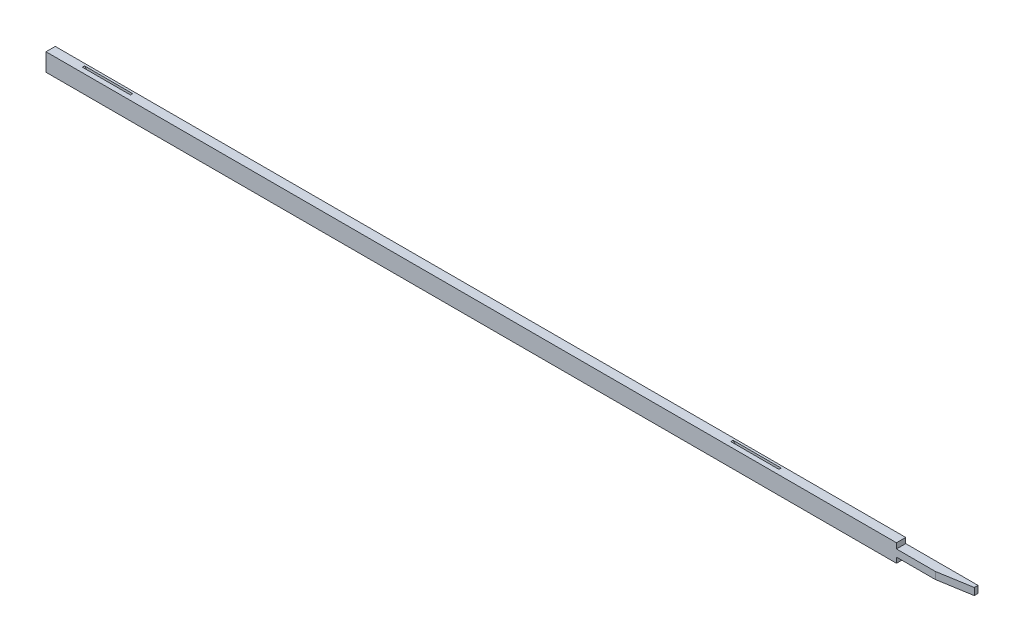
ISO-10303-21;
HEADER;
FILE_DESCRIPTION(('STEP AP214'),'2;1');
FILE_NAME('part.step','',(''),(''),'','','');
FILE_SCHEMA(('AUTOMOTIVE_DESIGN { 1 0 10303 214 1 1 1 1 }'));
ENDSEC;
DATA;
#1=APPLICATION_CONTEXT('core data for automotive mechanical design processes');
#2=APPLICATION_PROTOCOL_DEFINITION('international standard','automotive_design',2000,#1);
#3=PRODUCT_CONTEXT('',#1,'mechanical');
#4=PRODUCT('Part','Part','',(#3));
#5=PRODUCT_RELATED_PRODUCT_CATEGORY('part','',(#4));
#6=PRODUCT_DEFINITION_FORMATION('','',#4);
#7=PRODUCT_DEFINITION_CONTEXT('part definition',#1,'design');
#8=PRODUCT_DEFINITION('design','',#6,#7);
#9=PRODUCT_DEFINITION_SHAPE('','',#8);
#10=(LENGTH_UNIT() NAMED_UNIT(*) SI_UNIT(.MILLI.,.METRE.));
#11=(NAMED_UNIT(*) PLANE_ANGLE_UNIT() SI_UNIT($,.RADIAN.));
#12=(NAMED_UNIT(*) SI_UNIT($,.STERADIAN.) SOLID_ANGLE_UNIT());
#13=UNCERTAINTY_MEASURE_WITH_UNIT(LENGTH_MEASURE(1.E-05),#10,'distance_accuracy_value','');
#14=(GEOMETRIC_REPRESENTATION_CONTEXT(3) GLOBAL_UNCERTAINTY_ASSIGNED_CONTEXT((#13)) GLOBAL_UNIT_ASSIGNED_CONTEXT((#10,
#11,#12)) REPRESENTATION_CONTEXT('',''));
#15=CARTESIAN_POINT('',(0.,0.,0.));
#16=DIRECTION('',(0.,0.,1.));
#17=DIRECTION('',(1.,0.,0.));
#18=AXIS2_PLACEMENT_3D('',#15,#16,#17);
#19=CARTESIAN_POINT('',(92.5000000000003,16.5000000000001,6.));
#20=DIRECTION('',(0.,0.,-1.));
#21=DIRECTION('',(-1.,0.,0.));
#22=AXIS2_PLACEMENT_3D('',#19,#20,#21);
#23=PLANE('',#22);
#24=DIRECTION('',(1.,0.,0.));
#25=VECTOR('',#24,1.);
#26=CARTESIAN_POINT('',(92.5000000000003,24.0000000000001,6.));
#27=LINE('',#26,#25);
#28=CARTESIAN_POINT('',(85.0000000000002,24.0000000000001,6.));
#29=VERTEX_POINT('',#28);
#30=CARTESIAN_POINT('',(215.000000000001,24.0000000000001,6.00000000000004));
#31=VERTEX_POINT('',#30);
#32=EDGE_CURVE('E11',#29,#31,#27,.T.);
#33=ORIENTED_EDGE('',*,*,#32,.F.);
#34=DIRECTION('',(0.707106781186549,-0.707106781186546,0.));
#35=VECTOR('',#34,1.);
#36=CARTESIAN_POINT('',(92.5000000000003,16.5000000000001,6.));
#37=LINE('',#36,#35);
#38=CARTESIAN_POINT('',(92.5000000000003,16.5000000000001,6.));
#39=VERTEX_POINT('',#38);
#40=EDGE_CURVE('E370',#39,#29,#37,.F.);
#41=ORIENTED_EDGE('',*,*,#40,.F.);
#42=DIRECTION('',(1.,0.,0.));
#43=VECTOR('',#42,1.);
#44=CARTESIAN_POINT('',(92.5000000000003,16.5000000000001,6.));
#45=LINE('',#44,#43);
#46=CARTESIAN_POINT('',(207.5,16.5000000000001,6.00000000000004));
#47=VERTEX_POINT('',#46);
#48=EDGE_CURVE('E355',#39,#47,#45,.T.);
#49=ORIENTED_EDGE('',*,*,#48,.T.);
#50=DIRECTION('',(-0.707106781186549,-0.707106781186546,0.));
#51=VECTOR('',#50,1.);
#52=CARTESIAN_POINT('',(150.,-41.,6.00000000000002));
#53=LINE('',#52,#51);
#54=EDGE_CURVE('E42',#47,#31,#53,.F.);
#55=ORIENTED_EDGE('',*,*,#54,.T.);
#56=EDGE_LOOP('',(#33,#41,#49,#55));
#57=FACE_BOUND('',#56,.T.);
#58=ADVANCED_FACE('F35',(#57),#23,.F.);
#59=CARTESIAN_POINT('',(207.5,16.5000000000001,6.00000000000004));
#60=DIRECTION('',(-0.707106781186546,0.707106781186549,0.));
#61=DIRECTION('',(0.707106781186549,0.707106781186546,0.));
#62=AXIS2_PLACEMENT_3D('',#59,#60,#61);
#63=PLANE('',#62);
#64=DIRECTION('',(0.,0.,-1.));
#65=VECTOR('',#64,1.);
#66=CARTESIAN_POINT('',(215.000000000001,24.0000000000001,6.00000000000031));
#67=LINE('',#66,#65);
#68=CARTESIAN_POINT('',(215.,24.0000000000001,12.));
#69=VERTEX_POINT('',#68);
#70=EDGE_CURVE('E57',#31,#69,#67,.F.);
#71=ORIENTED_EDGE('',*,*,#70,.F.);
#72=ORIENTED_EDGE('',*,*,#54,.F.);
#73=DIRECTION('',(0.,0.,1.));
#74=VECTOR('',#73,1.);
#75=CARTESIAN_POINT('',(207.5,16.5000000000001,6.00000000000004));
#76=LINE('',#75,#74);
#77=CARTESIAN_POINT('',(207.5,16.5000000000001,12.));
#78=VERTEX_POINT('',#77);
#79=EDGE_CURVE('E352',#47,#78,#76,.T.);
#80=ORIENTED_EDGE('',*,*,#79,.T.);
#81=DIRECTION('',(-0.707106781186549,-0.707106781186546,0.));
#82=VECTOR('',#81,1.);
#83=CARTESIAN_POINT('',(207.5,16.5000000000002,12.));
#84=LINE('',#83,#82);
#85=EDGE_CURVE('E363',#78,#69,#84,.F.);
#86=ORIENTED_EDGE('',*,*,#85,.T.);
#87=EDGE_LOOP('',(#71,#72,#80,#86));
#88=FACE_BOUND('',#87,.T.);
#89=ADVANCED_FACE('F387',(#88),#63,.T.);
#90=CARTESIAN_POINT('',(92.5000000000003,16.5000000000001,12.));
#91=DIRECTION('',(0.707106781186546,0.707106781186549,0.));
#92=DIRECTION('',(0.707106781186549,-0.707106781186546,0.));
#93=AXIS2_PLACEMENT_3D('',#90,#91,#92);
#94=PLANE('',#93);
#95=DIRECTION('',(0.,0.,1.));
#96=VECTOR('',#95,1.);
#97=CARTESIAN_POINT('',(85.0000000000002,24.0000000000001,12.));
#98=LINE('',#97,#96);
#99=CARTESIAN_POINT('',(85.0000000000002,24.0000000000001,12.));
#100=VERTEX_POINT('',#99);
#101=EDGE_CURVE('E368',#100,#29,#98,.F.);
#102=ORIENTED_EDGE('',*,*,#101,.F.);
#103=DIRECTION('',(0.707106781186549,-0.707106781186546,0.));
#104=VECTOR('',#103,1.);
#105=CARTESIAN_POINT('',(150.,-40.9999999999999,12.));
#106=LINE('',#105,#104);
#107=CARTESIAN_POINT('',(92.5000000000003,16.5000000000001,12.));
#108=VERTEX_POINT('',#107);
#109=EDGE_CURVE('E365',#108,#100,#106,.F.);
#110=ORIENTED_EDGE('',*,*,#109,.F.);
#111=DIRECTION('',(0.,0.,-1.));
#112=VECTOR('',#111,1.);
#113=CARTESIAN_POINT('',(92.5000000000003,16.5000000000001,12.));
#114=LINE('',#113,#112);
#115=EDGE_CURVE('E358',#108,#39,#114,.T.);
#116=ORIENTED_EDGE('',*,*,#115,.T.);
#117=ORIENTED_EDGE('',*,*,#40,.T.);
#118=EDGE_LOOP('',(#102,#110,#116,#117));
#119=FACE_BOUND('',#118,.T.);
#120=ADVANCED_FACE('F382',(#119),#94,.T.);
#121=CARTESIAN_POINT('',(207.5,16.5000000000001,12.));
#122=DIRECTION('',(0.,0.,1.));
#123=DIRECTION('',(1.,0.,0.));
#124=AXIS2_PLACEMENT_3D('',#121,#122,#123);
#125=PLANE('',#124);
#126=DIRECTION('',(-1.,0.,0.));
#127=VECTOR('',#126,1.);
#128=CARTESIAN_POINT('',(207.5,24.0000000000001,12.));
#129=LINE('',#128,#127);
#130=EDGE_CURVE('E361',#69,#100,#129,.T.);
#131=ORIENTED_EDGE('',*,*,#130,.F.);
#132=ORIENTED_EDGE('',*,*,#85,.F.);
#133=DIRECTION('',(-1.,0.,0.));
#134=VECTOR('',#133,1.);
#135=CARTESIAN_POINT('',(207.5,16.5000000000001,12.));
#136=LINE('',#135,#134);
#137=EDGE_CURVE('E350',#78,#108,#136,.T.);
#138=ORIENTED_EDGE('',*,*,#137,.T.);
#139=ORIENTED_EDGE('',*,*,#109,.T.);
#140=EDGE_LOOP('',(#131,#132,#138,#139));
#141=FACE_BOUND('',#140,.T.);
#142=ADVANCED_FACE('F389',(#141),#125,.F.);
#143=CARTESIAN_POINT('',(-1750.,16.5,0.));
#144=DIRECTION('',(0.,1.,0.));
#145=DIRECTION('',(1.,0.,0.));
#146=AXIS2_PLACEMENT_3D('',#143,#144,#145);
#147=PLANE('',#146);
#148=ORIENTED_EDGE('',*,*,#137,.F.);
#149=ORIENTED_EDGE('',*,*,#79,.F.);
#150=ORIENTED_EDGE('',*,*,#48,.F.);
#151=ORIENTED_EDGE('',*,*,#115,.F.);
#152=EDGE_LOOP('',(#148,#149,#150,#151));
#153=FACE_BOUND('',#152,.T.);
#154=ADVANCED_FACE('F385',(#153),#147,.T.);
#155=CARTESIAN_POINT('',(207.5,-16.4999999999999,12.));
#156=DIRECTION('',(0.,0.,1.));
#157=DIRECTION('',(1.,0.,0.));
#158=AXIS2_PLACEMENT_3D('',#155,#156,#157);
#159=PLANE('',#158);
#160=DIRECTION('',(-1.,0.,0.));
#161=VECTOR('',#160,1.);
#162=CARTESIAN_POINT('',(207.5,-23.9999999999999,12.));
#163=LINE('',#162,#161);
#164=CARTESIAN_POINT('',(215.,-23.9999999999999,12.));
#165=VERTEX_POINT('',#164);
#166=CARTESIAN_POINT('',(85.0000000000002,-23.9999999999999,12.));
#167=VERTEX_POINT('',#166);
#168=EDGE_CURVE('E347',#165,#167,#163,.T.);
#169=ORIENTED_EDGE('',*,*,#168,.T.);
#170=DIRECTION('',(0.707106781186549,0.707106781186546,0.));
#171=VECTOR('',#170,1.);
#172=CARTESIAN_POINT('',(150.,41.0000000000001,12.));
#173=LINE('',#172,#171);
#174=CARTESIAN_POINT('',(92.5000000000003,-16.4999999999999,12.));
#175=VERTEX_POINT('',#174);
#176=EDGE_CURVE('E334',#175,#167,#173,.F.);
#177=ORIENTED_EDGE('',*,*,#176,.F.);
#178=DIRECTION('',(-1.,0.,0.));
#179=VECTOR('',#178,1.);
#180=CARTESIAN_POINT('',(207.5,-16.4999999999999,12.));
#181=LINE('',#180,#179);
#182=CARTESIAN_POINT('',(207.5,-16.4999999999999,12.));
#183=VERTEX_POINT('',#182);
#184=EDGE_CURVE('E320',#183,#175,#181,.T.);
#185=ORIENTED_EDGE('',*,*,#184,.F.);
#186=DIRECTION('',(-0.707106781186549,0.707106781186546,0.));
#187=VECTOR('',#186,1.);
#188=CARTESIAN_POINT('',(207.5,-16.5,12.));
#189=LINE('',#188,#187);
#190=EDGE_CURVE('E344',#183,#165,#189,.F.);
#191=ORIENTED_EDGE('',*,*,#190,.T.);
#192=EDGE_LOOP('',(#169,#177,#185,#191));
#193=FACE_BOUND('',#192,.T.);
#194=ADVANCED_FACE('F396',(#193),#159,.F.);
#195=CARTESIAN_POINT('',(207.5,-16.4999999999999,6.00000000000004));
#196=DIRECTION('',(-0.707106781186546,-0.707106781186549,0.));
#197=DIRECTION('',(0.707106781186549,-0.707106781186546,0.));
#198=AXIS2_PLACEMENT_3D('',#195,#196,#197);
#199=PLANE('',#198);
#200=DIRECTION('',(0.,0.,-1.));
#201=VECTOR('',#200,1.);
#202=CARTESIAN_POINT('',(215.000000000001,-23.9999999999999,6.00000000000031));
#203=LINE('',#202,#201);
#204=CARTESIAN_POINT('',(215.000000000001,-23.9999999999999,6.00000000000004));
#205=VERTEX_POINT('',#204);
#206=EDGE_CURVE('E342',#205,#165,#203,.F.);
#207=ORIENTED_EDGE('',*,*,#206,.T.);
#208=ORIENTED_EDGE('',*,*,#190,.F.);
#209=DIRECTION('',(0.,0.,1.));
#210=VECTOR('',#209,1.);
#211=CARTESIAN_POINT('',(207.5,-16.4999999999999,6.00000000000004));
#212=LINE('',#211,#210);
#213=CARTESIAN_POINT('',(207.5,-16.4999999999999,6.00000000000004));
#214=VERTEX_POINT('',#213);
#215=EDGE_CURVE('E326',#214,#183,#212,.T.);
#216=ORIENTED_EDGE('',*,*,#215,.F.);
#217=DIRECTION('',(-0.707106781186549,0.707106781186546,0.));
#218=VECTOR('',#217,1.);
#219=CARTESIAN_POINT('',(150.,41.0000000000002,6.00000000000002));
#220=LINE('',#219,#218);
#221=EDGE_CURVE('E339',#214,#205,#220,.F.);
#222=ORIENTED_EDGE('',*,*,#221,.T.);
#223=EDGE_LOOP('',(#207,#208,#216,#222));
#224=FACE_BOUND('',#223,.T.);
#225=ADVANCED_FACE('F428',(#224),#199,.T.);
#226=CARTESIAN_POINT('',(92.5000000000003,-16.4999999999999,6.));
#227=DIRECTION('',(0.,0.,-1.));
#228=DIRECTION('',(-1.,0.,0.));
#229=AXIS2_PLACEMENT_3D('',#226,#227,#228);
#230=PLANE('',#229);
#231=DIRECTION('',(1.,0.,0.));
#232=VECTOR('',#231,1.);
#233=CARTESIAN_POINT('',(92.5000000000003,-23.9999999999999,6.));
#234=LINE('',#233,#232);
#235=CARTESIAN_POINT('',(85.0000000000002,-23.9999999999999,6.));
#236=VERTEX_POINT('',#235);
#237=EDGE_CURVE('E337',#236,#205,#234,.T.);
#238=ORIENTED_EDGE('',*,*,#237,.T.);
#239=ORIENTED_EDGE('',*,*,#221,.F.);
#240=DIRECTION('',(1.,0.,0.));
#241=VECTOR('',#240,1.);
#242=CARTESIAN_POINT('',(92.5000000000003,-16.4999999999999,6.));
#243=LINE('',#242,#241);
#244=CARTESIAN_POINT('',(92.5000000000003,-16.4999999999999,6.));
#245=VERTEX_POINT('',#244);
#246=EDGE_CURVE('E324',#245,#214,#243,.T.);
#247=ORIENTED_EDGE('',*,*,#246,.F.);
#248=DIRECTION('',(0.707106781186549,0.707106781186546,0.));
#249=VECTOR('',#248,1.);
#250=CARTESIAN_POINT('',(92.5000000000003,-16.4999999999999,6.));
#251=LINE('',#250,#249);
#252=EDGE_CURVE('E331',#245,#236,#251,.F.);
#253=ORIENTED_EDGE('',*,*,#252,.T.);
#254=EDGE_LOOP('',(#238,#239,#247,#253));
#255=FACE_BOUND('',#254,.T.);
#256=ADVANCED_FACE('F438',(#255),#230,.F.);
#257=CARTESIAN_POINT('',(92.5000000000003,-16.4999999999999,12.));
#258=DIRECTION('',(0.707106781186546,-0.707106781186549,0.));
#259=DIRECTION('',(0.707106781186549,0.707106781186546,0.));
#260=AXIS2_PLACEMENT_3D('',#257,#258,#259);
#261=PLANE('',#260);
#262=DIRECTION('',(0.,0.,1.));
#263=VECTOR('',#262,1.);
#264=CARTESIAN_POINT('',(85.0000000000002,-23.9999999999999,12.));
#265=LINE('',#264,#263);
#266=EDGE_CURVE('E329',#167,#236,#265,.F.);
#267=ORIENTED_EDGE('',*,*,#266,.T.);
#268=ORIENTED_EDGE('',*,*,#252,.F.);
#269=DIRECTION('',(0.,0.,-1.));
#270=VECTOR('',#269,1.);
#271=CARTESIAN_POINT('',(92.5000000000003,-16.4999999999999,12.));
#272=LINE('',#271,#270);
#273=EDGE_CURVE('E322',#175,#245,#272,.T.);
#274=ORIENTED_EDGE('',*,*,#273,.F.);
#275=ORIENTED_EDGE('',*,*,#176,.T.);
#276=EDGE_LOOP('',(#267,#268,#274,#275));
#277=FACE_BOUND('',#276,.T.);
#278=ADVANCED_FACE('F448',(#277),#261,.T.);
#279=CARTESIAN_POINT('',(-1750.,-16.4999999999999,0.));
#280=DIRECTION('',(0.,-1.,0.));
#281=DIRECTION('',(1.,0.,0.));
#282=AXIS2_PLACEMENT_3D('',#279,#280,#281);
#283=PLANE('',#282);
#284=ORIENTED_EDGE('',*,*,#184,.T.);
#285=ORIENTED_EDGE('',*,*,#273,.T.);
#286=ORIENTED_EDGE('',*,*,#246,.T.);
#287=ORIENTED_EDGE('',*,*,#215,.T.);
#288=EDGE_LOOP('',(#284,#285,#286,#287));
#289=FACE_BOUND('',#288,.T.);
#290=ADVANCED_FACE('F458',(#289),#283,.T.);
#291=CARTESIAN_POINT('',(0.,16.4999999999999,0.));
#292=DIRECTION('',(0.,1.,0.));
#293=DIRECTION('',(1.,0.,0.));
#294=AXIS2_PLACEMENT_3D('',#291,#292,#293);
#295=PLANE('',#294);
#296=DIRECTION('',(-1.,0.,0.));
#297=VECTOR('',#296,1.);
#298=CARTESIAN_POINT('',(1957.5,16.5,12.));
#299=LINE('',#298,#297);
#300=CARTESIAN_POINT('',(1957.5,16.5,12.));
#301=VERTEX_POINT('',#300);
#302=CARTESIAN_POINT('',(1842.5,16.5,12.));
#303=VERTEX_POINT('',#302);
#304=EDGE_CURVE('E296',#301,#303,#299,.T.);
#305=ORIENTED_EDGE('',*,*,#304,.F.);
#306=DIRECTION('',(0.,0.,1.));
#307=VECTOR('',#306,1.);
#308=CARTESIAN_POINT('',(1957.5,16.5,6.00000000000004));
#309=LINE('',#308,#307);
#310=CARTESIAN_POINT('',(1957.5,16.5,6.00000000000004));
#311=VERTEX_POINT('',#310);
#312=EDGE_CURVE('E304',#311,#301,#309,.T.);
#313=ORIENTED_EDGE('',*,*,#312,.F.);
#314=DIRECTION('',(1.,0.,0.));
#315=VECTOR('',#314,1.);
#316=CARTESIAN_POINT('',(1842.5,16.5,6.));
#317=LINE('',#316,#315);
#318=CARTESIAN_POINT('',(1842.5,16.5,6.));
#319=VERTEX_POINT('',#318);
#320=EDGE_CURVE('E311',#319,#311,#317,.T.);
#321=ORIENTED_EDGE('',*,*,#320,.F.);
#322=DIRECTION('',(0.,0.,-1.));
#323=VECTOR('',#322,1.);
#324=CARTESIAN_POINT('',(1842.5,16.5,12.));
#325=LINE('',#324,#323);
#326=EDGE_CURVE('E318',#303,#319,#325,.T.);
#327=ORIENTED_EDGE('',*,*,#326,.F.);
#328=EDGE_LOOP('',(#305,#313,#321,#327));
#329=FACE_BOUND('',#328,.T.);
#330=ADVANCED_FACE('F468',(#329),#295,.T.);
#331=CARTESIAN_POINT('',(1842.5,16.5,12.));
#332=DIRECTION('',(0.707106781186546,0.707106781186549,0.));
#333=DIRECTION('',(0.707106781186549,-0.707106781186546,0.));
#334=AXIS2_PLACEMENT_3D('',#331,#332,#333);
#335=PLANE('',#334);
#336=DIRECTION('',(0.,0.,1.));
#337=VECTOR('',#336,1.);
#338=CARTESIAN_POINT('',(1835.,24.,12.));
#339=LINE('',#338,#337);
#340=CARTESIAN_POINT('',(1835.,24.,12.));
#341=VERTEX_POINT('',#340);
#342=CARTESIAN_POINT('',(1835.,24.,6.));
#343=VERTEX_POINT('',#342);
#344=EDGE_CURVE('E316',#341,#343,#339,.F.);
#345=ORIENTED_EDGE('',*,*,#344,.F.);
#346=DIRECTION('',(0.707106781186549,-0.707106781186546,0.));
#347=VECTOR('',#346,1.);
#348=CARTESIAN_POINT('',(1900.,-41.,12.));
#349=LINE('',#348,#347);
#350=EDGE_CURVE('E293',#303,#341,#349,.F.);
#351=ORIENTED_EDGE('',*,*,#350,.F.);
#352=ORIENTED_EDGE('',*,*,#326,.T.);
#353=DIRECTION('',(0.707106781186549,-0.707106781186546,0.));
#354=VECTOR('',#353,1.);
#355=CARTESIAN_POINT('',(1842.5,16.5,6.));
#356=LINE('',#355,#354);
#357=EDGE_CURVE('E313',#319,#343,#356,.F.);
#358=ORIENTED_EDGE('',*,*,#357,.T.);
#359=EDGE_LOOP('',(#345,#351,#352,#358));
#360=FACE_BOUND('',#359,.T.);
#361=ADVANCED_FACE('F629',(#360),#335,.T.);
#362=CARTESIAN_POINT('',(1842.5,16.5,6.));
#363=DIRECTION('',(0.,0.,-1.));
#364=DIRECTION('',(-1.,0.,0.));
#365=AXIS2_PLACEMENT_3D('',#362,#363,#364);
#366=PLANE('',#365);
#367=DIRECTION('',(1.,0.,0.));
#368=VECTOR('',#367,1.);
#369=CARTESIAN_POINT('',(1842.5,24.,6.));
#370=LINE('',#369,#368);
#371=CARTESIAN_POINT('',(1965.,24.,6.00000000000004));
#372=VERTEX_POINT('',#371);
#373=EDGE_CURVE('E309',#343,#372,#370,.T.);
#374=ORIENTED_EDGE('',*,*,#373,.F.);
#375=ORIENTED_EDGE('',*,*,#357,.F.);
#376=ORIENTED_EDGE('',*,*,#320,.T.);
#377=DIRECTION('',(-0.707106781186549,-0.707106781186546,0.));
#378=VECTOR('',#377,1.);
#379=CARTESIAN_POINT('',(1900.,-41.0000000000001,6.00000000000002));
#380=LINE('',#379,#378);
#381=EDGE_CURVE('E306',#311,#372,#380,.F.);
#382=ORIENTED_EDGE('',*,*,#381,.T.);
#383=EDGE_LOOP('',(#374,#375,#376,#382));
#384=FACE_BOUND('',#383,.T.);
#385=ADVANCED_FACE('F625',(#384),#366,.F.);
#386=CARTESIAN_POINT('',(1957.5,16.5,6.00000000000004));
#387=DIRECTION('',(-0.707106781186546,0.707106781186549,0.));
#388=DIRECTION('',(0.707106781186549,0.707106781186546,0.));
#389=AXIS2_PLACEMENT_3D('',#386,#387,#388);
#390=PLANE('',#389);
#391=DIRECTION('',(0.,0.,-1.));
#392=VECTOR('',#391,1.);
#393=CARTESIAN_POINT('',(1965.,24.,6.00000000000031));
#394=LINE('',#393,#392);
#395=CARTESIAN_POINT('',(1965.,24.,12.));
#396=VERTEX_POINT('',#395);
#397=EDGE_CURVE('E302',#372,#396,#394,.F.);
#398=ORIENTED_EDGE('',*,*,#397,.F.);
#399=ORIENTED_EDGE('',*,*,#381,.F.);
#400=ORIENTED_EDGE('',*,*,#312,.T.);
#401=DIRECTION('',(-0.707106781186549,-0.707106781186546,0.));
#402=VECTOR('',#401,1.);
#403=CARTESIAN_POINT('',(1957.5,16.5000000000001,12.));
#404=LINE('',#403,#402);
#405=EDGE_CURVE('E299',#301,#396,#404,.F.);
#406=ORIENTED_EDGE('',*,*,#405,.T.);
#407=EDGE_LOOP('',(#398,#399,#400,#406));
#408=FACE_BOUND('',#407,.T.);
#409=ADVANCED_FACE('F621',(#408),#390,.T.);
#410=CARTESIAN_POINT('',(1957.5,16.5,12.));
#411=DIRECTION('',(0.,0.,1.));
#412=DIRECTION('',(1.,0.,0.));
#413=AXIS2_PLACEMENT_3D('',#410,#411,#412);
#414=PLANE('',#413);
#415=DIRECTION('',(-1.,0.,0.));
#416=VECTOR('',#415,1.);
#417=CARTESIAN_POINT('',(1957.5,24.,12.));
#418=LINE('',#417,#416);
#419=EDGE_CURVE('E272',#396,#341,#418,.T.);
#420=ORIENTED_EDGE('',*,*,#419,.F.);
#421=ORIENTED_EDGE('',*,*,#405,.F.);
#422=ORIENTED_EDGE('',*,*,#304,.T.);
#423=ORIENTED_EDGE('',*,*,#350,.T.);
#424=EDGE_LOOP('',(#420,#421,#422,#423));
#425=FACE_BOUND('',#424,.T.);
#426=ADVANCED_FACE('F481',(#425),#414,.F.);
#427=CARTESIAN_POINT('',(2295.,24.0000000000014,25.));
#428=DIRECTION('',(0.,-1.,0.));
#429=DIRECTION('',(1.,0.,0.));
#430=AXIS2_PLACEMENT_3D('',#427,#428,#429);
#431=PLANE('',#430);
#432=ORIENTED_EDGE('',*,*,#101,.T.);
#433=ORIENTED_EDGE('',*,*,#32,.T.);
#434=ORIENTED_EDGE('',*,*,#70,.T.);
#435=ORIENTED_EDGE('',*,*,#130,.T.);
#436=EDGE_LOOP('',(#432,#433,#434,#435));
#437=FACE_BOUND('',#436,.T.);
#438=ORIENTED_EDGE('',*,*,#344,.T.);
#439=ORIENTED_EDGE('',*,*,#373,.T.);
#440=ORIENTED_EDGE('',*,*,#397,.T.);
#441=ORIENTED_EDGE('',*,*,#419,.T.);
#442=EDGE_LOOP('',(#438,#439,#440,#441));
#443=FACE_BOUND('',#442,.T.);
#444=DIRECTION('',(-1.,0.,0.));
#445=VECTOR('',#444,1.);
#446=CARTESIAN_POINT('',(2295.,24.0000000000014,0.));
#447=LINE('',#446,#445);
#448=CARTESIAN_POINT('',(2295.,24.0000000000014,0.));
#449=VERTEX_POINT('',#448);
#450=CARTESIAN_POINT('',(0.,24.0000000000001,0.));
#451=VERTEX_POINT('',#450);
#452=EDGE_CURVE('E233',#449,#451,#447,.T.);
#453=ORIENTED_EDGE('',*,*,#452,.T.);
#454=DIRECTION('',(0.,0.,-1.));
#455=VECTOR('',#454,1.);
#456=CARTESIAN_POINT('',(0.,24.0000000000001,25.));
#457=LINE('',#456,#455);
#458=CARTESIAN_POINT('',(0.,24.0000000000001,25.));
#459=VERTEX_POINT('',#458);
#460=EDGE_CURVE('E269',#459,#451,#457,.T.);
#461=ORIENTED_EDGE('',*,*,#460,.F.);
#462=DIRECTION('',(-1.,0.,0.));
#463=VECTOR('',#462,1.);
#464=CARTESIAN_POINT('',(2295.,24.0000000000014,25.));
#465=LINE('',#464,#463);
#466=CARTESIAN_POINT('',(2295.,24.0000000000014,25.));
#467=VERTEX_POINT('',#466);
#468=EDGE_CURVE('E252',#467,#459,#465,.T.);
#469=ORIENTED_EDGE('',*,*,#468,.F.);
#470=DIRECTION('',(0.,0.,-1.));
#471=VECTOR('',#470,1.);
#472=CARTESIAN_POINT('',(2295.,24.0000000000014,25.));
#473=LINE('',#472,#471);
#474=EDGE_CURVE('E232',#467,#449,#473,.T.);
#475=ORIENTED_EDGE('',*,*,#474,.T.);
#476=EDGE_LOOP('',(#453,#461,#469,#475));
#477=FACE_BOUND('',#476,.T.);
#478=ADVANCED_FACE('F377',(#437,#443,#477),#431,.F.);
#479=CARTESIAN_POINT('',(0.,24.0000000000001,25.));
#480=DIRECTION('',(1.,0.,0.));
#481=DIRECTION('',(0.,0.,-1.));
#482=AXIS2_PLACEMENT_3D('',#479,#480,#481);
#483=PLANE('',#482);
#484=DIRECTION('',(0.,-1.,0.));
#485=VECTOR('',#484,1.);
#486=CARTESIAN_POINT('',(0.,24.0000000000001,0.));
#487=LINE('',#486,#485);
#488=CARTESIAN_POINT('',(0.,-23.9999999999999,0.));
#489=VERTEX_POINT('',#488);
#490=EDGE_CURVE('E236',#451,#489,#487,.T.);
#491=ORIENTED_EDGE('',*,*,#490,.T.);
#492=DIRECTION('',(0.,0.,-1.));
#493=VECTOR('',#492,1.);
#494=CARTESIAN_POINT('',(0.,-23.9999999999999,25.));
#495=LINE('',#494,#493);
#496=CARTESIAN_POINT('',(0.,-23.9999999999999,25.));
#497=VERTEX_POINT('',#496);
#498=EDGE_CURVE('E266',#497,#489,#495,.T.);
#499=ORIENTED_EDGE('',*,*,#498,.F.);
#500=DIRECTION('',(0.,-1.,0.));
#501=VECTOR('',#500,1.);
#502=CARTESIAN_POINT('',(0.,24.0000000000001,25.));
#503=LINE('',#502,#501);
#504=EDGE_CURVE('E656',#459,#497,#503,.T.);
#505=ORIENTED_EDGE('',*,*,#504,.F.);
#506=ORIENTED_EDGE('',*,*,#460,.T.);
#507=EDGE_LOOP('',(#491,#499,#505,#506));
#508=FACE_BOUND('',#507,.T.);
#509=ADVANCED_FACE('F480',(#508),#483,.F.);
#510=CARTESIAN_POINT('',(0.,-23.9999999999999,25.));
#511=DIRECTION('',(0.,1.,0.));
#512=DIRECTION('',(-1.,0.,0.));
#513=AXIS2_PLACEMENT_3D('',#510,#511,#512);
#514=PLANE('',#513);
#515=ORIENTED_EDGE('',*,*,#266,.F.);
#516=ORIENTED_EDGE('',*,*,#168,.F.);
#517=ORIENTED_EDGE('',*,*,#206,.F.);
#518=ORIENTED_EDGE('',*,*,#237,.F.);
#519=EDGE_LOOP('',(#515,#516,#517,#518));
#520=FACE_BOUND('',#519,.T.);
#521=DIRECTION('',(0.,0.,1.));
#522=VECTOR('',#521,1.);
#523=CARTESIAN_POINT('',(1835.,-24.,12.));
#524=LINE('',#523,#522);
#525=CARTESIAN_POINT('',(1835.,-24.,12.));
#526=VERTEX_POINT('',#525);
#527=CARTESIAN_POINT('',(1835.,-24.,6.));
#528=VERTEX_POINT('',#527);
#529=EDGE_CURVE('E282',#526,#528,#524,.F.);
#530=ORIENTED_EDGE('',*,*,#529,.F.);
#531=DIRECTION('',(-1.,0.,0.));
#532=VECTOR('',#531,1.);
#533=CARTESIAN_POINT('',(1957.5,-24.,12.));
#534=LINE('',#533,#532);
#535=CARTESIAN_POINT('',(1965.,-24.,12.));
#536=VERTEX_POINT('',#535);
#537=EDGE_CURVE('E285',#536,#526,#534,.T.);
#538=ORIENTED_EDGE('',*,*,#537,.F.);
#539=DIRECTION('',(0.,0.,-1.));
#540=VECTOR('',#539,1.);
#541=CARTESIAN_POINT('',(1965.,-24.,6.00000000000031));
#542=LINE('',#541,#540);
#543=CARTESIAN_POINT('',(1965.,-24.,6.00000000000004));
#544=VERTEX_POINT('',#543);
#545=EDGE_CURVE('E273',#544,#536,#542,.F.);
#546=ORIENTED_EDGE('',*,*,#545,.F.);
#547=DIRECTION('',(1.,0.,0.));
#548=VECTOR('',#547,1.);
#549=CARTESIAN_POINT('',(1842.5,-24.,6.));
#550=LINE('',#549,#548);
#551=EDGE_CURVE('E277',#528,#544,#550,.T.);
#552=ORIENTED_EDGE('',*,*,#551,.F.);
#553=EDGE_LOOP('',(#530,#538,#546,#552));
#554=FACE_BOUND('',#553,.T.);
#555=DIRECTION('',(1.,0.,0.));
#556=VECTOR('',#555,1.);
#557=CARTESIAN_POINT('',(0.,-23.9999999999999,0.));
#558=LINE('',#557,#556);
#559=CARTESIAN_POINT('',(2295.,-24.,0.));
#560=VERTEX_POINT('',#559);
#561=EDGE_CURVE('E239',#489,#560,#558,.T.);
#562=ORIENTED_EDGE('',*,*,#561,.T.);
#563=DIRECTION('',(0.,0.,-1.));
#564=VECTOR('',#563,1.);
#565=CARTESIAN_POINT('',(2295.,-24.,25.));
#566=LINE('',#565,#564);
#567=CARTESIAN_POINT('',(2295.,-24.,25.));
#568=VERTEX_POINT('',#567);
#569=EDGE_CURVE('E263',#568,#560,#566,.T.);
#570=ORIENTED_EDGE('',*,*,#569,.F.);
#571=DIRECTION('',(1.,0.,0.));
#572=VECTOR('',#571,1.);
#573=CARTESIAN_POINT('',(0.,-23.9999999999999,25.));
#574=LINE('',#573,#572);
#575=EDGE_CURVE('E227',#497,#568,#574,.T.);
#576=ORIENTED_EDGE('',*,*,#575,.F.);
#577=ORIENTED_EDGE('',*,*,#498,.T.);
#578=EDGE_LOOP('',(#562,#570,#576,#577));
#579=FACE_BOUND('',#578,.T.);
#580=ADVANCED_FACE('F489',(#520,#554,#579),#514,.F.);
#581=CARTESIAN_POINT('',(2295.,-24.,25.));
#582=DIRECTION('',(-1.,0.,0.));
#583=DIRECTION('',(0.,0.,1.));
#584=AXIS2_PLACEMENT_3D('',#581,#582,#583);
#585=PLANE('',#584);
#586=DIRECTION('',(0.,1.,0.));
#587=VECTOR('',#586,1.);
#588=CARTESIAN_POINT('',(2295.,-24.,0.));
#589=LINE('',#588,#587);
#590=CARTESIAN_POINT('',(2295.,-9.5,0.));
#591=VERTEX_POINT('',#590);
#592=EDGE_CURVE('E241',#560,#591,#589,.T.);
#593=ORIENTED_EDGE('',*,*,#592,.T.);
#594=DIRECTION('',(0.,0.,-1.));
#595=VECTOR('',#594,1.);
#596=CARTESIAN_POINT('',(2295.,-9.5,25.));
#597=LINE('',#596,#595);
#598=CARTESIAN_POINT('',(2295.,-9.5,25.));
#599=VERTEX_POINT('',#598);
#600=EDGE_CURVE('E261',#599,#591,#597,.T.);
#601=ORIENTED_EDGE('',*,*,#600,.F.);
#602=DIRECTION('',(0.,1.,0.));
#603=VECTOR('',#602,1.);
#604=CARTESIAN_POINT('',(2295.,-24.,25.));
#605=LINE('',#604,#603);
#606=EDGE_CURVE('E221',#568,#599,#605,.T.);
#607=ORIENTED_EDGE('',*,*,#606,.F.);
#608=ORIENTED_EDGE('',*,*,#569,.T.);
#609=EDGE_LOOP('',(#593,#601,#607,#608));
#610=FACE_BOUND('',#609,.T.);
#611=ADVANCED_FACE('F494',(#610),#585,.F.);
#612=CARTESIAN_POINT('',(2490.,-9.5,25.));
#613=DIRECTION('',(0.,1.,0.));
#614=DIRECTION('',(-1.,0.,0.));
#615=AXIS2_PLACEMENT_3D('',#612,#613,#614);
#616=PLANE('',#615);
#617=DIRECTION('',(0.,0.,-1.));
#618=VECTOR('',#617,1.);
#619=CARTESIAN_POINT('',(2490.,-9.5,25.));
#620=LINE('',#619,#618);
#621=CARTESIAN_POINT('',(2490.,-9.5,10.));
#622=VERTEX_POINT('',#621);
#623=CARTESIAN_POINT('',(2490.,-9.5,0.));
#624=VERTEX_POINT('',#623);
#625=EDGE_CURVE('E217',#622,#624,#620,.T.);
#626=ORIENTED_EDGE('',*,*,#625,.F.);
#627=DIRECTION('',(0.986393923832144,0.,-0.164398987305358));
#628=VECTOR('',#627,1.);
#629=CARTESIAN_POINT('',(2400.,-9.5,25.));
#630=LINE('',#629,#628);
#631=CARTESIAN_POINT('',(2400.,-9.5,25.));
#632=VERTEX_POINT('',#631);
#633=EDGE_CURVE('E203',#632,#622,#630,.T.);
#634=ORIENTED_EDGE('',*,*,#633,.F.);
#635=DIRECTION('',(1.,0.,0.));
#636=VECTOR('',#635,1.);
#637=CARTESIAN_POINT('',(2490.,-9.5,25.));
#638=LINE('',#637,#636);
#639=EDGE_CURVE('E215',#599,#632,#638,.T.);
#640=ORIENTED_EDGE('',*,*,#639,.F.);
#641=ORIENTED_EDGE('',*,*,#600,.T.);
#642=DIRECTION('',(1.,0.,0.));
#643=VECTOR('',#642,1.);
#644=CARTESIAN_POINT('',(2490.,-9.5,0.));
#645=LINE('',#644,#643);
#646=EDGE_CURVE('E243',#591,#624,#645,.T.);
#647=ORIENTED_EDGE('',*,*,#646,.T.);
#648=EDGE_LOOP('',(#626,#634,#640,#641,#647));
#649=FACE_BOUND('',#648,.T.);
#650=ADVANCED_FACE('F213',(#649),#616,.F.);
#651=CARTESIAN_POINT('',(2490.,9.5,25.));
#652=DIRECTION('',(-1.,0.,0.));
#653=DIRECTION('',(0.,0.,1.));
#654=AXIS2_PLACEMENT_3D('',#651,#652,#653);
#655=PLANE('',#654);
#656=DIRECTION('',(0.,0.,-1.));
#657=VECTOR('',#656,1.);
#658=CARTESIAN_POINT('',(2490.,9.5,25.));
#659=LINE('',#658,#657);
#660=CARTESIAN_POINT('',(2490.,9.5,10.));
#661=VERTEX_POINT('',#660);
#662=CARTESIAN_POINT('',(2490.,9.5,0.));
#663=VERTEX_POINT('',#662);
#664=EDGE_CURVE('E258',#661,#663,#659,.T.);
#665=ORIENTED_EDGE('',*,*,#664,.F.);
#666=DIRECTION('',(0.,-1.,0.));
#667=VECTOR('',#666,1.);
#668=CARTESIAN_POINT('',(2490.,24.0010000000014,10.));
#669=LINE('',#668,#667);
#670=EDGE_CURVE('E208',#661,#622,#669,.T.);
#671=ORIENTED_EDGE('',*,*,#670,.T.);
#672=ORIENTED_EDGE('',*,*,#625,.T.);
#673=DIRECTION('',(0.,1.,0.));
#674=VECTOR('',#673,1.);
#675=CARTESIAN_POINT('',(2490.,9.5,0.));
#676=LINE('',#675,#674);
#677=EDGE_CURVE('E245',#624,#663,#676,.T.);
#678=ORIENTED_EDGE('',*,*,#677,.T.);
#679=EDGE_LOOP('',(#665,#671,#672,#678));
#680=FACE_BOUND('',#679,.T.);
#681=ADVANCED_FACE('F506',(#680),#655,.F.);
#682=CARTESIAN_POINT('',(2295.,9.5,25.));
#683=DIRECTION('',(0.,-1.,0.));
#684=DIRECTION('',(1.,0.,0.));
#685=AXIS2_PLACEMENT_3D('',#682,#683,#684);
#686=PLANE('',#685);
#687=DIRECTION('',(-1.,0.,0.));
#688=VECTOR('',#687,1.);
#689=CARTESIAN_POINT('',(2295.,9.5,25.));
#690=LINE('',#689,#688);
#691=CARTESIAN_POINT('',(2400.,9.5,25.));
#692=VERTEX_POINT('',#691);
#693=CARTESIAN_POINT('',(2295.,9.5,25.));
#694=VERTEX_POINT('',#693);
#695=EDGE_CURVE('E223',#692,#694,#690,.T.);
#696=ORIENTED_EDGE('',*,*,#695,.F.);
#697=DIRECTION('',(-0.986393923832144,0.,0.164398987305358));
#698=VECTOR('',#697,1.);
#699=CARTESIAN_POINT('',(2400.,9.5,25.));
#700=LINE('',#699,#698);
#701=EDGE_CURVE('E49',#661,#692,#700,.T.);
#702=ORIENTED_EDGE('',*,*,#701,.F.);
#703=ORIENTED_EDGE('',*,*,#664,.T.);
#704=DIRECTION('',(-1.,0.,0.));
#705=VECTOR('',#704,1.);
#706=CARTESIAN_POINT('',(2295.,9.5,0.));
#707=LINE('',#706,#705);
#708=CARTESIAN_POINT('',(2295.,9.5,0.));
#709=VERTEX_POINT('',#708);
#710=EDGE_CURVE('E248',#663,#709,#707,.T.);
#711=ORIENTED_EDGE('',*,*,#710,.T.);
#712=DIRECTION('',(0.,0.,-1.));
#713=VECTOR('',#712,1.);
#714=CARTESIAN_POINT('',(2295.,9.5,25.));
#715=LINE('',#714,#713);
#716=EDGE_CURVE('E255',#694,#709,#715,.T.);
#717=ORIENTED_EDGE('',*,*,#716,.F.);
#718=EDGE_LOOP('',(#696,#702,#703,#711,#717));
#719=FACE_BOUND('',#718,.T.);
#720=ADVANCED_FACE('F515',(#719),#686,.F.);
#721=CARTESIAN_POINT('',(2295.,9.5,25.));
#722=DIRECTION('',(-1.,0.,0.));
#723=DIRECTION('',(0.,0.,1.));
#724=AXIS2_PLACEMENT_3D('',#721,#722,#723);
#725=PLANE('',#724);
#726=DIRECTION('',(0.,1.,0.));
#727=VECTOR('',#726,1.);
#728=CARTESIAN_POINT('',(2295.,9.5,0.));
#729=LINE('',#728,#727);
#730=EDGE_CURVE('E250',#709,#449,#729,.T.);
#731=ORIENTED_EDGE('',*,*,#730,.T.);
#732=ORIENTED_EDGE('',*,*,#474,.F.);
#733=DIRECTION('',(0.,1.,0.));
#734=VECTOR('',#733,1.);
#735=CARTESIAN_POINT('',(2295.,9.5,25.));
#736=LINE('',#735,#734);
#737=EDGE_CURVE('E225',#694,#467,#736,.T.);
#738=ORIENTED_EDGE('',*,*,#737,.F.);
#739=ORIENTED_EDGE('',*,*,#716,.T.);
#740=EDGE_LOOP('',(#731,#732,#738,#739));
#741=FACE_BOUND('',#740,.T.);
#742=ADVANCED_FACE('F525',(#741),#725,.F.);
#743=CARTESIAN_POINT('',(0.,0.,25.));
#744=DIRECTION('',(0.,0.,1.));
#745=DIRECTION('',(1.,0.,0.));
#746=AXIS2_PLACEMENT_3D('',#743,#744,#745);
#747=PLANE('',#746);
#748=DIRECTION('',(0.,-1.,0.));
#749=VECTOR('',#748,1.);
#750=CARTESIAN_POINT('',(2400.,24.0010000000014,25.));
#751=LINE('',#750,#749);
#752=EDGE_CURVE('E200',#692,#632,#751,.T.);
#753=ORIENTED_EDGE('',*,*,#752,.F.);
#754=ORIENTED_EDGE('',*,*,#695,.T.);
#755=ORIENTED_EDGE('',*,*,#737,.T.);
#756=ORIENTED_EDGE('',*,*,#468,.T.);
#757=ORIENTED_EDGE('',*,*,#504,.T.);
#758=ORIENTED_EDGE('',*,*,#575,.T.);
#759=ORIENTED_EDGE('',*,*,#606,.T.);
#760=ORIENTED_EDGE('',*,*,#639,.T.);
#761=EDGE_LOOP('',(#753,#754,#755,#756,#757,#758,#759,#760));
#762=FACE_BOUND('',#761,.T.);
#763=ADVANCED_FACE('F219',(#762),#747,.T.);
#764=CARTESIAN_POINT('',(0.,0.,0.));
#765=DIRECTION('',(0.,0.,1.));
#766=DIRECTION('',(1.,0.,0.));
#767=AXIS2_PLACEMENT_3D('',#764,#765,#766);
#768=PLANE('',#767);
#769=ORIENTED_EDGE('',*,*,#452,.F.);
#770=ORIENTED_EDGE('',*,*,#730,.F.);
#771=ORIENTED_EDGE('',*,*,#710,.F.);
#772=ORIENTED_EDGE('',*,*,#677,.F.);
#773=ORIENTED_EDGE('',*,*,#646,.F.);
#774=ORIENTED_EDGE('',*,*,#592,.F.);
#775=ORIENTED_EDGE('',*,*,#561,.F.);
#776=ORIENTED_EDGE('',*,*,#490,.F.);
#777=EDGE_LOOP('',(#769,#770,#771,#772,#773,#774,#775,#776));
#778=FACE_BOUND('',#777,.T.);
#779=ADVANCED_FACE('F537',(#778),#768,.F.);
#780=CARTESIAN_POINT('',(1957.5,-16.5,12.));
#781=DIRECTION('',(0.,0.,1.));
#782=DIRECTION('',(1.,0.,0.));
#783=AXIS2_PLACEMENT_3D('',#780,#781,#782);
#784=PLANE('',#783);
#785=ORIENTED_EDGE('',*,*,#537,.T.);
#786=DIRECTION('',(0.707106781186549,0.707106781186546,0.));
#787=VECTOR('',#786,1.);
#788=CARTESIAN_POINT('',(1900.,41.,12.));
#789=LINE('',#788,#787);
#790=CARTESIAN_POINT('',(1842.5,-16.5,12.));
#791=VERTEX_POINT('',#790);
#792=EDGE_CURVE('E286',#791,#526,#789,.F.);
#793=ORIENTED_EDGE('',*,*,#792,.F.);
#794=DIRECTION('',(-1.,0.,0.));
#795=VECTOR('',#794,1.);
#796=CARTESIAN_POINT('',(1957.5,-16.5,12.));
#797=LINE('',#796,#795);
#798=CARTESIAN_POINT('',(1957.5,-16.5,12.));
#799=VERTEX_POINT('',#798);
#800=EDGE_CURVE('E276',#799,#791,#797,.T.);
#801=ORIENTED_EDGE('',*,*,#800,.F.);
#802=DIRECTION('',(-0.707106781186549,0.707106781186546,0.));
#803=VECTOR('',#802,1.);
#804=CARTESIAN_POINT('',(1957.5,-16.5000000000001,12.));
#805=LINE('',#804,#803);
#806=EDGE_CURVE('E237',#799,#536,#805,.F.);
#807=ORIENTED_EDGE('',*,*,#806,.T.);
#808=EDGE_LOOP('',(#785,#793,#801,#807));
#809=FACE_BOUND('',#808,.T.);
#810=ADVANCED_FACE('F582',(#809),#784,.F.);
#811=CARTESIAN_POINT('',(1957.5,-16.5,6.00000000000004));
#812=DIRECTION('',(-0.707106781186546,-0.707106781186549,0.));
#813=DIRECTION('',(0.707106781186549,-0.707106781186546,0.));
#814=AXIS2_PLACEMENT_3D('',#811,#812,#813);
#815=PLANE('',#814);
#816=ORIENTED_EDGE('',*,*,#545,.T.);
#817=ORIENTED_EDGE('',*,*,#806,.F.);
#818=DIRECTION('',(0.,0.,1.));
#819=VECTOR('',#818,1.);
#820=CARTESIAN_POINT('',(1957.5,-16.5,6.00000000000004));
#821=LINE('',#820,#819);
#822=CARTESIAN_POINT('',(1957.5,-16.5,6.00000000000004));
#823=VERTEX_POINT('',#822);
#824=EDGE_CURVE('E289',#823,#799,#821,.T.);
#825=ORIENTED_EDGE('',*,*,#824,.F.);
#826=DIRECTION('',(-0.707106781186549,0.707106781186546,0.));
#827=VECTOR('',#826,1.);
#828=CARTESIAN_POINT('',(1900.,41.0000000000001,6.00000000000002));
#829=LINE('',#828,#827);
#830=EDGE_CURVE('E278',#823,#544,#829,.F.);
#831=ORIENTED_EDGE('',*,*,#830,.T.);
#832=EDGE_LOOP('',(#816,#817,#825,#831));
#833=FACE_BOUND('',#832,.T.);
#834=ADVANCED_FACE('F574',(#833),#815,.T.);
#835=CARTESIAN_POINT('',(1842.5,-16.5,6.));
#836=DIRECTION('',(0.,0.,-1.));
#837=DIRECTION('',(-1.,0.,0.));
#838=AXIS2_PLACEMENT_3D('',#835,#836,#837);
#839=PLANE('',#838);
#840=ORIENTED_EDGE('',*,*,#551,.T.);
#841=ORIENTED_EDGE('',*,*,#830,.F.);
#842=DIRECTION('',(1.,0.,0.));
#843=VECTOR('',#842,1.);
#844=CARTESIAN_POINT('',(1842.5,-16.5,6.));
#845=LINE('',#844,#843);
#846=CARTESIAN_POINT('',(1842.5,-16.5,6.));
#847=VERTEX_POINT('',#846);
#848=EDGE_CURVE('E677',#847,#823,#845,.T.);
#849=ORIENTED_EDGE('',*,*,#848,.F.);
#850=DIRECTION('',(0.707106781186549,0.707106781186546,0.));
#851=VECTOR('',#850,1.);
#852=CARTESIAN_POINT('',(1842.5,-16.5,6.));
#853=LINE('',#852,#851);
#854=EDGE_CURVE('E280',#847,#528,#853,.F.);
#855=ORIENTED_EDGE('',*,*,#854,.T.);
#856=EDGE_LOOP('',(#840,#841,#849,#855));
#857=FACE_BOUND('',#856,.T.);
#858=ADVANCED_FACE('F565',(#857),#839,.F.);
#859=CARTESIAN_POINT('',(1842.5,-16.5,12.));
#860=DIRECTION('',(0.707106781186546,-0.707106781186549,0.));
#861=DIRECTION('',(0.707106781186549,0.707106781186546,0.));
#862=AXIS2_PLACEMENT_3D('',#859,#860,#861);
#863=PLANE('',#862);
#864=ORIENTED_EDGE('',*,*,#529,.T.);
#865=ORIENTED_EDGE('',*,*,#854,.F.);
#866=DIRECTION('',(0.,0.,-1.));
#867=VECTOR('',#866,1.);
#868=CARTESIAN_POINT('',(1842.5,-16.5,12.));
#869=LINE('',#868,#867);
#870=EDGE_CURVE('E674',#791,#847,#869,.T.);
#871=ORIENTED_EDGE('',*,*,#870,.F.);
#872=ORIENTED_EDGE('',*,*,#792,.T.);
#873=EDGE_LOOP('',(#864,#865,#871,#872));
#874=FACE_BOUND('',#873,.T.);
#875=ADVANCED_FACE('F555',(#874),#863,.T.);
#876=CARTESIAN_POINT('',(0.,-16.4999999999999,0.));
#877=DIRECTION('',(0.,-1.,0.));
#878=DIRECTION('',(1.,0.,0.));
#879=AXIS2_PLACEMENT_3D('',#876,#877,#878);
#880=PLANE('',#879);
#881=ORIENTED_EDGE('',*,*,#800,.T.);
#882=ORIENTED_EDGE('',*,*,#870,.T.);
#883=ORIENTED_EDGE('',*,*,#848,.T.);
#884=ORIENTED_EDGE('',*,*,#824,.T.);
#885=EDGE_LOOP('',(#881,#882,#883,#884));
#886=FACE_BOUND('',#885,.T.);
#887=ADVANCED_FACE('F546',(#886),#880,.T.);
#888=CARTESIAN_POINT('',(2400.,24.0010000000014,25.));
#889=DIRECTION('',(-0.164398987305358,0.,-0.986393923832144));
#890=DIRECTION('',(-0.986393923832144,0.,0.164398987305358));
#891=AXIS2_PLACEMENT_3D('',#888,#889,#890);
#892=PLANE('',#891);
#893=ORIENTED_EDGE('',*,*,#701,.T.);
#894=ORIENTED_EDGE('',*,*,#752,.T.);
#895=ORIENTED_EDGE('',*,*,#633,.T.);
#896=ORIENTED_EDGE('',*,*,#670,.F.);
#897=EDGE_LOOP('',(#893,#894,#895,#896));
#898=FACE_BOUND('',#897,.T.);
#899=ADVANCED_FACE('F202',(#898),#892,.F.);
#900=CLOSED_SHELL('',(#58,#89,#120,#142,#154,#194,#225,#256,#278,#290,#330,#361,#385,#409,#426,
#478,#509,#580,#611,#650,#681,#720,#742,#763,#779,#810,#834,#858,#875,#887,#899));
#901=MANIFOLD_SOLID_BREP('B2',#900);
#902=ADVANCED_BREP_SHAPE_REPRESENTATION('',(#18,#901),#14);
#903=SHAPE_DEFINITION_REPRESENTATION(#9,#902);
ENDSEC;
END-ISO-10303-21;
